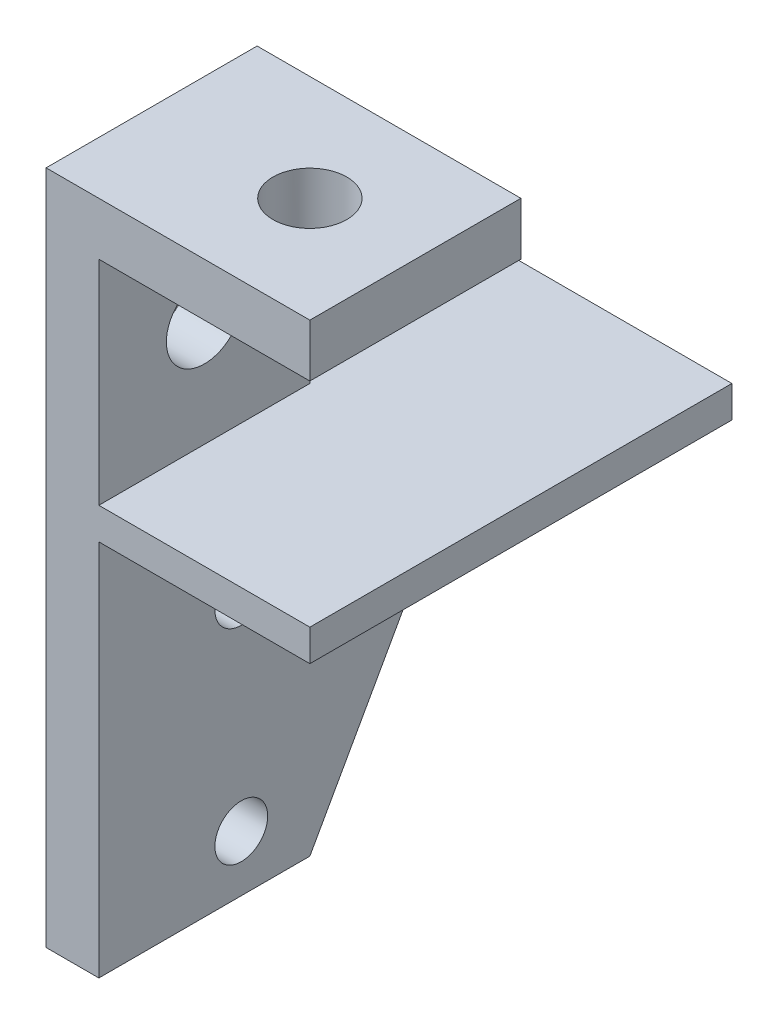
ISO-10303-21;
HEADER;
FILE_DESCRIPTION(('STEP AP214'),'2;1');
FILE_NAME('part.step','',(''),(''),'','','');
FILE_SCHEMA(('AUTOMOTIVE_DESIGN { 1 0 10303 214 1 1 1 1 }'));
ENDSEC;
DATA;
#1=APPLICATION_CONTEXT('core data for automotive mechanical design processes');
#2=APPLICATION_PROTOCOL_DEFINITION('international standard','automotive_design',2000,#1);
#3=PRODUCT_CONTEXT('',#1,'mechanical');
#4=PRODUCT('Part','Part','',(#3));
#5=PRODUCT_RELATED_PRODUCT_CATEGORY('part','',(#4));
#6=PRODUCT_DEFINITION_FORMATION('','',#4);
#7=PRODUCT_DEFINITION_CONTEXT('part definition',#1,'design');
#8=PRODUCT_DEFINITION('design','',#6,#7);
#9=PRODUCT_DEFINITION_SHAPE('','',#8);
#10=(LENGTH_UNIT() NAMED_UNIT(*) SI_UNIT(.MILLI.,.METRE.));
#11=(NAMED_UNIT(*) PLANE_ANGLE_UNIT() SI_UNIT($,.RADIAN.));
#12=(NAMED_UNIT(*) SI_UNIT($,.STERADIAN.) SOLID_ANGLE_UNIT());
#13=UNCERTAINTY_MEASURE_WITH_UNIT(LENGTH_MEASURE(1.E-05),#10,'distance_accuracy_value','');
#14=(GEOMETRIC_REPRESENTATION_CONTEXT(3) GLOBAL_UNCERTAINTY_ASSIGNED_CONTEXT((#13)) GLOBAL_UNIT_ASSIGNED_CONTEXT((#10,
#11,#12)) REPRESENTATION_CONTEXT('',''));
#15=CARTESIAN_POINT('',(0.,0.,0.));
#16=DIRECTION('',(0.,0.,1.));
#17=DIRECTION('',(1.,0.,0.));
#18=AXIS2_PLACEMENT_3D('',#15,#16,#17);
#19=CARTESIAN_POINT('',(0.,22.4,10.));
#20=DIRECTION('',(0.,-1.,0.));
#21=DIRECTION('',(0.,0.,-1.));
#22=AXIS2_PLACEMENT_3D('',#19,#20,#21);
#23=PLANE('',#22);
#24=DIRECTION('',(0.,0.,1.));
#25=VECTOR('',#24,1.);
#26=CARTESIAN_POINT('',(2.5,22.4,10.));
#27=LINE('',#26,#25);
#28=CARTESIAN_POINT('',(2.5,22.4,-10.));
#29=VERTEX_POINT('',#28);
#30=CARTESIAN_POINT('',(2.5,22.4,10.));
#31=VERTEX_POINT('',#30);
#32=EDGE_CURVE('E73',#29,#31,#27,.T.);
#33=ORIENTED_EDGE('',*,*,#32,.F.);
#34=DIRECTION('',(-1.,0.,0.));
#35=VECTOR('',#34,1.);
#36=CARTESIAN_POINT('',(0.,22.4,-10.));
#37=LINE('',#36,#35);
#38=CARTESIAN_POINT('',(12.5,22.4,-10.));
#39=VERTEX_POINT('',#38);
#40=EDGE_CURVE('E140',#39,#29,#37,.T.);
#41=ORIENTED_EDGE('',*,*,#40,.F.);
#42=DIRECTION('',(0.,0.,-1.));
#43=VECTOR('',#42,1.);
#44=CARTESIAN_POINT('',(12.5,22.4,10.));
#45=LINE('',#44,#43);
#46=CARTESIAN_POINT('',(12.5,22.4,10.));
#47=VERTEX_POINT('',#46);
#48=EDGE_CURVE('E190',#47,#39,#45,.T.);
#49=ORIENTED_EDGE('',*,*,#48,.F.);
#50=DIRECTION('',(-1.,0.,0.));
#51=VECTOR('',#50,1.);
#52=CARTESIAN_POINT('',(0.,22.4,10.));
#53=LINE('',#52,#51);
#54=EDGE_CURVE('E142',#47,#31,#53,.T.);
#55=ORIENTED_EDGE('',*,*,#54,.T.);
#56=EDGE_LOOP('',(#33,#41,#49,#55));
#57=FACE_BOUND('',#56,.T.);
#58=ADVANCED_FACE('F47',(#57),#23,.T.);
#59=CARTESIAN_POINT('',(2.5,34.,10.));
#60=DIRECTION('',(-1.,0.,0.));
#61=DIRECTION('',(0.,-1.,0.));
#62=AXIS2_PLACEMENT_3D('',#59,#60,#61);
#63=PLANE('',#62);
#64=CARTESIAN_POINT('',(2.5,16.85,3.25));
#65=DIRECTION('',(1.,0.,0.));
#66=DIRECTION('',(0.,-1.,0.));
#67=AXIS2_PLACEMENT_3D('',#64,#65,#66);
#68=CIRCLE('',#67,1.25);
#69=CARTESIAN_POINT('',(2.5,15.6,3.25));
#70=VERTEX_POINT('',#69);
#71=EDGE_CURVE('E219',#70,#70,#68,.T.);
#72=ORIENTED_EDGE('',*,*,#71,.F.);
#73=EDGE_LOOP('',(#72));
#74=FACE_BOUND('',#73,.T.);
#75=CARTESIAN_POINT('',(2.5,7.15,3.25));
#76=DIRECTION('',(1.,0.,0.));
#77=DIRECTION('',(0.,1.,0.));
#78=AXIS2_PLACEMENT_3D('',#75,#76,#77);
#79=CIRCLE('',#78,1.25);
#80=CARTESIAN_POINT('',(2.5,8.4,3.25));
#81=VERTEX_POINT('',#80);
#82=EDGE_CURVE('E211',#81,#81,#79,.T.);
#83=ORIENTED_EDGE('',*,*,#82,.F.);
#84=EDGE_LOOP('',(#83));
#85=FACE_BOUND('',#84,.T.);
#86=DIRECTION('',(0.,0.,1.));
#87=VECTOR('',#86,1.);
#88=CARTESIAN_POINT('',(2.5,4.5,0.));
#89=LINE('',#88,#87);
#90=CARTESIAN_POINT('',(2.5,4.5,0.));
#91=VERTEX_POINT('',#90);
#92=CARTESIAN_POINT('',(2.5,4.5,10.));
#93=VERTEX_POINT('',#92);
#94=EDGE_CURVE('E144',#91,#93,#89,.T.);
#95=ORIENTED_EDGE('',*,*,#94,.F.);
#96=DIRECTION('',(0.,-0.873004559860684,0.487712044614907));
#97=VECTOR('',#96,1.);
#98=CARTESIAN_POINT('',(2.5,22.4,-10.));
#99=LINE('',#98,#97);
#100=EDGE_CURVE('E152',#29,#91,#99,.T.);
#101=ORIENTED_EDGE('',*,*,#100,.F.);
#102=ORIENTED_EDGE('',*,*,#32,.T.);
#103=DIRECTION('',(0.,1.,0.));
#104=VECTOR('',#103,1.);
#105=CARTESIAN_POINT('',(2.5,34.,10.));
#106=LINE('',#105,#104);
#107=EDGE_CURVE('E234',#93,#31,#106,.T.);
#108=ORIENTED_EDGE('',*,*,#107,.F.);
#109=EDGE_LOOP('',(#95,#101,#102,#108));
#110=FACE_BOUND('',#109,.T.);
#111=ADVANCED_FACE('F160',(#74,#85,#110),#63,.F.);
#112=CARTESIAN_POINT('',(2.5,29.,5.));
#113=DIRECTION('',(1.,0.,0.));
#114=DIRECTION('',(0.,1.,0.));
#115=AXIS2_PLACEMENT_3D('',#112,#113,#114);
#116=CIRCLE('',#115,1.8);
#117=CARTESIAN_POINT('',(2.5,30.8,5.));
#118=VERTEX_POINT('',#117);
#119=EDGE_CURVE('E204',#118,#118,#116,.T.);
#120=ORIENTED_EDGE('',*,*,#119,.F.);
#121=EDGE_LOOP('',(#120));
#122=FACE_BOUND('',#121,.T.);
#123=CARTESIAN_POINT('',(2.5,23.9,10.));
#124=VERTEX_POINT('',#123);
#125=CARTESIAN_POINT('',(2.5,34.,10.));
#126=VERTEX_POINT('',#125);
#127=EDGE_CURVE('E65',#124,#126,#106,.T.);
#128=ORIENTED_EDGE('',*,*,#127,.F.);
#129=DIRECTION('',(0.,0.,-1.));
#130=VECTOR('',#129,1.);
#131=CARTESIAN_POINT('',(2.5,23.9,10.));
#132=LINE('',#131,#130);
#133=CARTESIAN_POINT('',(2.5,23.9,0.));
#134=VERTEX_POINT('',#133);
#135=EDGE_CURVE('E145',#124,#134,#132,.T.);
#136=ORIENTED_EDGE('',*,*,#135,.T.);
#137=DIRECTION('',(0.,1.,0.));
#138=VECTOR('',#137,1.);
#139=CARTESIAN_POINT('',(2.5,34.,0.));
#140=LINE('',#139,#138);
#141=CARTESIAN_POINT('',(2.5,34.,0.));
#142=VERTEX_POINT('',#141);
#143=EDGE_CURVE('E250',#134,#142,#140,.T.);
#144=ORIENTED_EDGE('',*,*,#143,.T.);
#145=DIRECTION('',(0.,0.,-1.));
#146=VECTOR('',#145,1.);
#147=CARTESIAN_POINT('',(2.5,34.,10.));
#148=LINE('',#147,#146);
#149=EDGE_CURVE('E57',#126,#142,#148,.T.);
#150=ORIENTED_EDGE('',*,*,#149,.F.);
#151=EDGE_LOOP('',(#128,#136,#144,#150));
#152=FACE_BOUND('',#151,.T.);
#153=ADVANCED_FACE('F49',(#122,#152),#63,.F.);
#154=CARTESIAN_POINT('',(12.5,34.,10.));
#155=DIRECTION('',(0.,1.,0.));
#156=DIRECTION('',(0.,0.,1.));
#157=AXIS2_PLACEMENT_3D('',#154,#155,#156);
#158=PLANE('',#157);
#159=CARTESIAN_POINT('',(7.5,34.,5.));
#160=DIRECTION('',(0.,-1.,0.));
#161=DIRECTION('',(1.,0.,0.));
#162=AXIS2_PLACEMENT_3D('',#159,#160,#161);
#163=CIRCLE('',#162,1.75);
#164=CARTESIAN_POINT('',(9.25,34.,5.));
#165=VERTEX_POINT('',#164);
#166=EDGE_CURVE('E210',#165,#165,#163,.T.);
#167=ORIENTED_EDGE('',*,*,#166,.F.);
#168=EDGE_LOOP('',(#167));
#169=FACE_BOUND('',#168,.T.);
#170=DIRECTION('',(1.,0.,0.));
#171=VECTOR('',#170,1.);
#172=CARTESIAN_POINT('',(12.5,34.,0.));
#173=LINE('',#172,#171);
#174=CARTESIAN_POINT('',(12.5,34.,0.));
#175=VERTEX_POINT('',#174);
#176=EDGE_CURVE('E253',#142,#175,#173,.T.);
#177=ORIENTED_EDGE('',*,*,#176,.T.);
#178=DIRECTION('',(0.,0.,-1.));
#179=VECTOR('',#178,1.);
#180=CARTESIAN_POINT('',(12.5,34.,10.));
#181=LINE('',#180,#179);
#182=CARTESIAN_POINT('',(12.5,34.,10.));
#183=VERTEX_POINT('',#182);
#184=EDGE_CURVE('E273',#183,#175,#181,.T.);
#185=ORIENTED_EDGE('',*,*,#184,.F.);
#186=DIRECTION('',(1.,0.,0.));
#187=VECTOR('',#186,1.);
#188=CARTESIAN_POINT('',(12.5,34.,10.));
#189=LINE('',#188,#187);
#190=EDGE_CURVE('E237',#126,#183,#189,.T.);
#191=ORIENTED_EDGE('',*,*,#190,.F.);
#192=ORIENTED_EDGE('',*,*,#149,.T.);
#193=EDGE_LOOP('',(#177,#185,#191,#192));
#194=FACE_BOUND('',#193,.T.);
#195=ADVANCED_FACE('F379',(#169,#194),#158,.F.);
#196=CARTESIAN_POINT('',(12.5,36.5,10.));
#197=DIRECTION('',(-1.,0.,0.));
#198=DIRECTION('',(0.,-1.,0.));
#199=AXIS2_PLACEMENT_3D('',#196,#197,#198);
#200=PLANE('',#199);
#201=DIRECTION('',(0.,1.,0.));
#202=VECTOR('',#201,1.);
#203=CARTESIAN_POINT('',(12.5,36.5,0.));
#204=LINE('',#203,#202);
#205=CARTESIAN_POINT('',(12.5,36.5,0.));
#206=VERTEX_POINT('',#205);
#207=EDGE_CURVE('E256',#175,#206,#204,.T.);
#208=ORIENTED_EDGE('',*,*,#207,.T.);
#209=DIRECTION('',(0.,0.,-1.));
#210=VECTOR('',#209,1.);
#211=CARTESIAN_POINT('',(12.5,36.5,10.));
#212=LINE('',#211,#210);
#213=CARTESIAN_POINT('',(12.5,36.5,10.));
#214=VERTEX_POINT('',#213);
#215=EDGE_CURVE('E269',#214,#206,#212,.T.);
#216=ORIENTED_EDGE('',*,*,#215,.F.);
#217=DIRECTION('',(0.,1.,0.));
#218=VECTOR('',#217,1.);
#219=CARTESIAN_POINT('',(12.5,36.5,10.));
#220=LINE('',#219,#218);
#221=EDGE_CURVE('E240',#183,#214,#220,.T.);
#222=ORIENTED_EDGE('',*,*,#221,.F.);
#223=ORIENTED_EDGE('',*,*,#184,.T.);
#224=EDGE_LOOP('',(#208,#216,#222,#223));
#225=FACE_BOUND('',#224,.T.);
#226=ADVANCED_FACE('F381',(#225),#200,.F.);
#227=CARTESIAN_POINT('',(0.,36.5,10.));
#228=DIRECTION('',(0.,-1.,0.));
#229=DIRECTION('',(0.,0.,-1.));
#230=AXIS2_PLACEMENT_3D('',#227,#228,#229);
#231=PLANE('',#230);
#232=CARTESIAN_POINT('',(7.5,36.5,5.));
#233=DIRECTION('',(0.,-1.,0.));
#234=DIRECTION('',(0.,0.,-1.));
#235=AXIS2_PLACEMENT_3D('',#232,#233,#234);
#236=CIRCLE('',#235,1.75);
#237=CARTESIAN_POINT('',(7.5,36.5,3.25));
#238=VERTEX_POINT('',#237);
#239=EDGE_CURVE('E233',#238,#238,#236,.T.);
#240=ORIENTED_EDGE('',*,*,#239,.T.);
#241=EDGE_LOOP('',(#240));
#242=FACE_BOUND('',#241,.T.);
#243=DIRECTION('',(-1.,0.,0.));
#244=VECTOR('',#243,1.);
#245=CARTESIAN_POINT('',(0.,36.5,0.));
#246=LINE('',#245,#244);
#247=CARTESIAN_POINT('',(0.,36.5,0.));
#248=VERTEX_POINT('',#247);
#249=EDGE_CURVE('E259',#206,#248,#246,.T.);
#250=ORIENTED_EDGE('',*,*,#249,.T.);
#251=DIRECTION('',(0.,0.,-1.));
#252=VECTOR('',#251,1.);
#253=CARTESIAN_POINT('',(0.,36.5,10.));
#254=LINE('',#253,#252);
#255=CARTESIAN_POINT('',(0.,36.5,10.));
#256=VERTEX_POINT('',#255);
#257=EDGE_CURVE('E249',#256,#248,#254,.T.);
#258=ORIENTED_EDGE('',*,*,#257,.F.);
#259=DIRECTION('',(-1.,0.,0.));
#260=VECTOR('',#259,1.);
#261=CARTESIAN_POINT('',(0.,36.5,10.));
#262=LINE('',#261,#260);
#263=EDGE_CURVE('E243',#214,#256,#262,.T.);
#264=ORIENTED_EDGE('',*,*,#263,.F.);
#265=ORIENTED_EDGE('',*,*,#215,.T.);
#266=EDGE_LOOP('',(#250,#258,#264,#265));
#267=FACE_BOUND('',#266,.T.);
#268=ADVANCED_FACE('F283',(#242,#267),#231,.F.);
#269=CARTESIAN_POINT('',(0.,0.,10.));
#270=DIRECTION('',(1.,0.,0.));
#271=DIRECTION('',(0.,1.,0.));
#272=AXIS2_PLACEMENT_3D('',#269,#270,#271);
#273=PLANE('',#272);
#274=DIRECTION('',(0.,1.,0.));
#275=VECTOR('',#274,1.);
#276=CARTESIAN_POINT('',(0.,23.9,-10.));
#277=LINE('',#276,#275);
#278=CARTESIAN_POINT('',(0.,22.4,-10.));
#279=VERTEX_POINT('',#278);
#280=CARTESIAN_POINT('',(0.,23.9,-10.));
#281=VERTEX_POINT('',#280);
#282=EDGE_CURVE('E162',#279,#281,#277,.T.);
#283=ORIENTED_EDGE('',*,*,#282,.F.);
#284=DIRECTION('',(0.,-0.873004559860684,0.487712044614907));
#285=VECTOR('',#284,1.);
#286=CARTESIAN_POINT('',(0.,13.45,-5.));
#287=LINE('',#286,#285);
#288=CARTESIAN_POINT('',(0.,4.5,0.));
#289=VERTEX_POINT('',#288);
#290=EDGE_CURVE('E154',#279,#289,#287,.T.);
#291=ORIENTED_EDGE('',*,*,#290,.T.);
#292=DIRECTION('',(0.,0.,1.));
#293=VECTOR('',#292,1.);
#294=CARTESIAN_POINT('',(0.,4.5,0.));
#295=LINE('',#294,#293);
#296=CARTESIAN_POINT('',(0.,4.5,10.));
#297=VERTEX_POINT('',#296);
#298=EDGE_CURVE('E344',#289,#297,#295,.T.);
#299=ORIENTED_EDGE('',*,*,#298,.T.);
#300=DIRECTION('',(0.,-1.,0.));
#301=VECTOR('',#300,1.);
#302=CARTESIAN_POINT('',(0.,0.,10.));
#303=LINE('',#302,#301);
#304=EDGE_CURVE('E246',#256,#297,#303,.T.);
#305=ORIENTED_EDGE('',*,*,#304,.F.);
#306=ORIENTED_EDGE('',*,*,#257,.T.);
#307=DIRECTION('',(0.,-1.,0.));
#308=VECTOR('',#307,1.);
#309=CARTESIAN_POINT('',(0.,0.,0.));
#310=LINE('',#309,#308);
#311=CARTESIAN_POINT('',(0.,23.9,0.));
#312=VERTEX_POINT('',#311);
#313=EDGE_CURVE('E262',#248,#312,#310,.T.);
#314=ORIENTED_EDGE('',*,*,#313,.T.);
#315=DIRECTION('',(0.,0.,-1.));
#316=VECTOR('',#315,1.);
#317=CARTESIAN_POINT('',(0.,23.9,10.));
#318=LINE('',#317,#316);
#319=EDGE_CURVE('E189',#312,#281,#318,.T.);
#320=ORIENTED_EDGE('',*,*,#319,.T.);
#321=EDGE_LOOP('',(#283,#291,#299,#305,#306,#314,#320));
#322=FACE_BOUND('',#321,.T.);
#323=CARTESIAN_POINT('',(0.,29.,5.));
#324=DIRECTION('',(1.,0.,0.));
#325=DIRECTION('',(0.,1.,0.));
#326=AXIS2_PLACEMENT_3D('',#323,#324,#325);
#327=CIRCLE('',#326,1.8);
#328=CARTESIAN_POINT('',(0.,30.8,5.));
#329=VERTEX_POINT('',#328);
#330=EDGE_CURVE('E223',#329,#329,#327,.T.);
#331=ORIENTED_EDGE('',*,*,#330,.T.);
#332=EDGE_LOOP('',(#331));
#333=FACE_BOUND('',#332,.T.);
#334=CARTESIAN_POINT('',(0.,16.85,3.25));
#335=DIRECTION('',(1.,0.,0.));
#336=DIRECTION('',(0.,-1.,0.));
#337=AXIS2_PLACEMENT_3D('',#334,#335,#336);
#338=CIRCLE('',#337,1.25);
#339=CARTESIAN_POINT('',(0.,15.6,3.25));
#340=VERTEX_POINT('',#339);
#341=EDGE_CURVE('E215',#340,#340,#338,.T.);
#342=ORIENTED_EDGE('',*,*,#341,.T.);
#343=EDGE_LOOP('',(#342));
#344=FACE_BOUND('',#343,.T.);
#345=CARTESIAN_POINT('',(0.,7.15,3.25));
#346=DIRECTION('',(1.,0.,0.));
#347=DIRECTION('',(0.,1.,0.));
#348=AXIS2_PLACEMENT_3D('',#345,#346,#347);
#349=CIRCLE('',#348,1.25);
#350=CARTESIAN_POINT('',(0.,8.4,3.25));
#351=VERTEX_POINT('',#350);
#352=EDGE_CURVE('E206',#351,#351,#349,.T.);
#353=ORIENTED_EDGE('',*,*,#352,.T.);
#354=EDGE_LOOP('',(#353));
#355=FACE_BOUND('',#354,.T.);
#356=ADVANCED_FACE('F357',(#322,#333,#344,#355),#273,.F.);
#357=CARTESIAN_POINT('',(0.,0.,10.));
#358=DIRECTION('',(0.,0.,-1.));
#359=DIRECTION('',(-1.,0.,0.));
#360=AXIS2_PLACEMENT_3D('',#357,#358,#359);
#361=PLANE('',#360);
#362=ORIENTED_EDGE('',*,*,#304,.T.);
#363=DIRECTION('',(1.,0.,0.));
#364=VECTOR('',#363,1.);
#365=CARTESIAN_POINT('',(0.,4.5,10.));
#366=LINE('',#365,#364);
#367=EDGE_CURVE('E200',#297,#93,#366,.T.);
#368=ORIENTED_EDGE('',*,*,#367,.T.);
#369=ORIENTED_EDGE('',*,*,#107,.T.);
#370=ORIENTED_EDGE('',*,*,#54,.F.);
#371=DIRECTION('',(0.,-1.,0.));
#372=VECTOR('',#371,1.);
#373=CARTESIAN_POINT('',(12.5,23.9,10.));
#374=LINE('',#373,#372);
#375=CARTESIAN_POINT('',(12.5,23.9,10.));
#376=VERTEX_POINT('',#375);
#377=EDGE_CURVE('E174',#376,#47,#374,.T.);
#378=ORIENTED_EDGE('',*,*,#377,.F.);
#379=DIRECTION('',(1.,0.,0.));
#380=VECTOR('',#379,1.);
#381=CARTESIAN_POINT('',(0.,23.9,10.));
#382=LINE('',#381,#380);
#383=EDGE_CURVE('E170',#124,#376,#382,.T.);
#384=ORIENTED_EDGE('',*,*,#383,.F.);
#385=ORIENTED_EDGE('',*,*,#127,.T.);
#386=ORIENTED_EDGE('',*,*,#190,.T.);
#387=ORIENTED_EDGE('',*,*,#221,.T.);
#388=ORIENTED_EDGE('',*,*,#263,.T.);
#389=EDGE_LOOP('',(#362,#368,#369,#370,#378,#384,#385,#386,#387,#388));
#390=FACE_BOUND('',#389,.T.);
#391=ADVANCED_FACE('F300',(#390),#361,.F.);
#392=CARTESIAN_POINT('',(0.,0.,0.));
#393=DIRECTION('',(0.,0.,-1.));
#394=DIRECTION('',(-1.,0.,0.));
#395=AXIS2_PLACEMENT_3D('',#392,#393,#394);
#396=PLANE('',#395);
#397=DIRECTION('',(1.,0.,0.));
#398=VECTOR('',#397,1.);
#399=CARTESIAN_POINT('',(0.,23.9,0.));
#400=LINE('',#399,#398);
#401=EDGE_CURVE('E12',#312,#134,#400,.T.);
#402=ORIENTED_EDGE('',*,*,#401,.F.);
#403=ORIENTED_EDGE('',*,*,#313,.F.);
#404=ORIENTED_EDGE('',*,*,#249,.F.);
#405=ORIENTED_EDGE('',*,*,#207,.F.);
#406=ORIENTED_EDGE('',*,*,#176,.F.);
#407=ORIENTED_EDGE('',*,*,#143,.F.);
#408=EDGE_LOOP('',(#402,#403,#404,#405,#406,#407));
#409=FACE_BOUND('',#408,.T.);
#410=ADVANCED_FACE('F289',(#409),#396,.T.);
#411=CARTESIAN_POINT('',(7.49999999999999,44.,5.));
#412=DIRECTION('',(0.,-1.,0.));
#413=DIRECTION('',(1.,0.,0.));
#414=AXIS2_PLACEMENT_3D('',#411,#412,#413);
#415=CYLINDRICAL_SURFACE('',#414,1.75);
#416=ORIENTED_EDGE('',*,*,#166,.T.);
#417=EDGE_LOOP('',(#416));
#418=FACE_BOUND('',#417,.T.);
#419=ORIENTED_EDGE('',*,*,#239,.F.);
#420=EDGE_LOOP('',(#419));
#421=FACE_BOUND('',#420,.T.);
#422=ADVANCED_FACE('F286',(#418,#421),#415,.F.);
#423=CARTESIAN_POINT('',(0.,29.,5.));
#424=DIRECTION('',(1.,0.,0.));
#425=DIRECTION('',(0.,1.,0.));
#426=AXIS2_PLACEMENT_3D('',#423,#424,#425);
#427=CYLINDRICAL_SURFACE('',#426,1.8);
#428=ORIENTED_EDGE('',*,*,#330,.F.);
#429=EDGE_LOOP('',(#428));
#430=FACE_BOUND('',#429,.T.);
#431=ORIENTED_EDGE('',*,*,#119,.T.);
#432=EDGE_LOOP('',(#431));
#433=FACE_BOUND('',#432,.T.);
#434=ADVANCED_FACE('F288',(#430,#433),#427,.F.);
#435=CARTESIAN_POINT('',(0.,16.85,3.25));
#436=DIRECTION('',(1.,0.,0.));
#437=DIRECTION('',(0.,1.,0.));
#438=AXIS2_PLACEMENT_3D('',#435,#436,#437);
#439=CYLINDRICAL_SURFACE('',#438,1.25);
#440=ORIENTED_EDGE('',*,*,#341,.F.);
#441=EDGE_LOOP('',(#440));
#442=FACE_BOUND('',#441,.T.);
#443=ORIENTED_EDGE('',*,*,#71,.T.);
#444=EDGE_LOOP('',(#443));
#445=FACE_BOUND('',#444,.T.);
#446=ADVANCED_FACE('F296',(#442,#445),#439,.F.);
#447=CARTESIAN_POINT('',(0.,7.15,3.25));
#448=DIRECTION('',(1.,0.,0.));
#449=DIRECTION('',(0.,1.,0.));
#450=AXIS2_PLACEMENT_3D('',#447,#448,#449);
#451=CYLINDRICAL_SURFACE('',#450,1.25);
#452=ORIENTED_EDGE('',*,*,#352,.F.);
#453=EDGE_LOOP('',(#452));
#454=FACE_BOUND('',#453,.T.);
#455=ORIENTED_EDGE('',*,*,#82,.T.);
#456=EDGE_LOOP('',(#455));
#457=FACE_BOUND('',#456,.T.);
#458=ADVANCED_FACE('F326',(#454,#457),#451,.F.);
#459=CARTESIAN_POINT('',(0.,4.5,0.));
#460=DIRECTION('',(0.,1.,0.));
#461=DIRECTION('',(0.,0.,1.));
#462=AXIS2_PLACEMENT_3D('',#459,#460,#461);
#463=PLANE('',#462);
#464=ORIENTED_EDGE('',*,*,#298,.F.);
#465=CARTESIAN_POINT('',(0.,4.5,0.));
#466=DIRECTION('',(1.,0.,0.));
#467=VECTOR('',#466,1.);
#468=LINE('',#465,#467);
#469=EDGE_CURVE('E205',#289,#91,#468,.T.);
#470=ORIENTED_EDGE('',*,*,#469,.T.);
#471=ORIENTED_EDGE('',*,*,#94,.T.);
#472=ORIENTED_EDGE('',*,*,#367,.F.);
#473=EDGE_LOOP('',(#464,#470,#471,#472));
#474=FACE_BOUND('',#473,.T.);
#475=ADVANCED_FACE('F321',(#474),#463,.F.);
#476=CARTESIAN_POINT('',(0.,23.9,10.));
#477=DIRECTION('',(0.,1.,0.));
#478=DIRECTION('',(0.,0.,1.));
#479=AXIS2_PLACEMENT_3D('',#476,#477,#478);
#480=PLANE('',#479);
#481=ORIENTED_EDGE('',*,*,#135,.F.);
#482=ORIENTED_EDGE('',*,*,#383,.T.);
#483=DIRECTION('',(0.,0.,-1.));
#484=VECTOR('',#483,1.);
#485=CARTESIAN_POINT('',(12.5,23.9,10.));
#486=LINE('',#485,#484);
#487=CARTESIAN_POINT('',(12.5,23.9,-10.));
#488=VERTEX_POINT('',#487);
#489=EDGE_CURVE('E193',#376,#488,#486,.T.);
#490=ORIENTED_EDGE('',*,*,#489,.T.);
#491=DIRECTION('',(1.,0.,0.));
#492=VECTOR('',#491,1.);
#493=CARTESIAN_POINT('',(0.,23.9,-10.));
#494=LINE('',#493,#492);
#495=EDGE_CURVE('E176',#281,#488,#494,.T.);
#496=ORIENTED_EDGE('',*,*,#495,.F.);
#497=ORIENTED_EDGE('',*,*,#319,.F.);
#498=ORIENTED_EDGE('',*,*,#401,.T.);
#499=EDGE_LOOP('',(#481,#482,#490,#496,#497,#498));
#500=FACE_BOUND('',#499,.T.);
#501=ADVANCED_FACE('F317',(#500),#480,.T.);
#502=CARTESIAN_POINT('',(12.5,23.9,10.));
#503=DIRECTION('',(1.,0.,0.));
#504=DIRECTION('',(0.,0.,-1.));
#505=AXIS2_PLACEMENT_3D('',#502,#503,#504);
#506=PLANE('',#505);
#507=ORIENTED_EDGE('',*,*,#48,.T.);
#508=DIRECTION('',(0.,-1.,0.));
#509=VECTOR('',#508,1.);
#510=CARTESIAN_POINT('',(12.5,23.9,-10.));
#511=LINE('',#510,#509);
#512=EDGE_CURVE('E168',#488,#39,#511,.T.);
#513=ORIENTED_EDGE('',*,*,#512,.F.);
#514=ORIENTED_EDGE('',*,*,#489,.F.);
#515=ORIENTED_EDGE('',*,*,#377,.T.);
#516=EDGE_LOOP('',(#507,#513,#514,#515));
#517=FACE_BOUND('',#516,.T.);
#518=ADVANCED_FACE('F314',(#517),#506,.T.);
#519=CARTESIAN_POINT('',(0.,0.,-10.));
#520=DIRECTION('',(0.,0.,1.));
#521=DIRECTION('',(1.,0.,0.));
#522=AXIS2_PLACEMENT_3D('',#519,#520,#521);
#523=PLANE('',#522);
#524=ORIENTED_EDGE('',*,*,#282,.T.);
#525=ORIENTED_EDGE('',*,*,#495,.T.);
#526=ORIENTED_EDGE('',*,*,#512,.T.);
#527=ORIENTED_EDGE('',*,*,#40,.T.);
#528=DIRECTION('',(1.,0.,0.));
#529=VECTOR('',#528,1.);
#530=CARTESIAN_POINT('',(0.,22.4,-10.));
#531=LINE('',#530,#529);
#532=EDGE_CURVE('E149',#279,#29,#531,.T.);
#533=ORIENTED_EDGE('',*,*,#532,.F.);
#534=EDGE_LOOP('',(#524,#525,#526,#527,#533));
#535=FACE_BOUND('',#534,.T.);
#536=ADVANCED_FACE('F165',(#535),#523,.F.);
#537=CARTESIAN_POINT('',(0.,1.07038367308104,1.91598677481506));
#538=DIRECTION('',(0.,0.487712044614907,0.873004559860684));
#539=DIRECTION('',(0.,-0.873004559860684,0.487712044614907));
#540=AXIS2_PLACEMENT_3D('',#537,#538,#539);
#541=PLANE('',#540);
#542=ORIENTED_EDGE('',*,*,#100,.T.);
#543=ORIENTED_EDGE('',*,*,#469,.F.);
#544=ORIENTED_EDGE('',*,*,#290,.F.);
#545=ORIENTED_EDGE('',*,*,#532,.T.);
#546=EDGE_LOOP('',(#542,#543,#544,#545));
#547=FACE_BOUND('',#546,.T.);
#548=ADVANCED_FACE('F150',(#547),#541,.F.);
#549=CLOSED_SHELL('',(#58,#111,#153,#195,#226,#268,#356,#391,#410,#422,#434,#446,#458,#475,#501,
#518,#536,#548));
#550=MANIFOLD_SOLID_BREP('B2',#549);
#551=ADVANCED_BREP_SHAPE_REPRESENTATION('',(#18,#550),#14);
#552=SHAPE_DEFINITION_REPRESENTATION(#9,#551);
ENDSEC;
END-ISO-10303-21;
